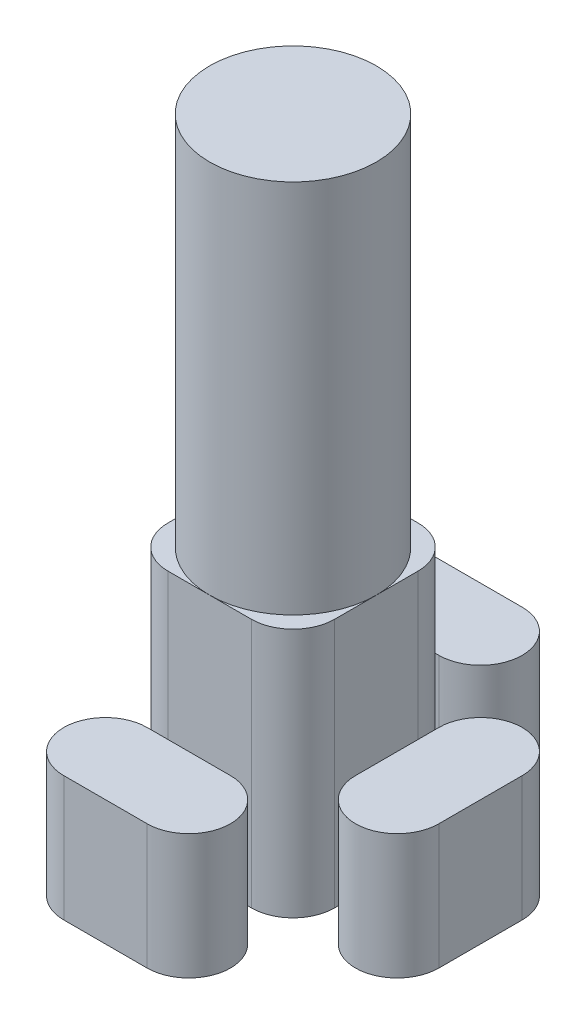
ISO-10303-21;
HEADER;
FILE_DESCRIPTION(('STEP AP214'),'2;1');
FILE_NAME('part.step','',(''),(''),'','','');
FILE_SCHEMA(('AUTOMOTIVE_DESIGN { 1 0 10303 214 1 1 1 1 }'));
ENDSEC;
DATA;
#1=APPLICATION_CONTEXT('core data for automotive mechanical design processes');
#2=APPLICATION_PROTOCOL_DEFINITION('international standard','automotive_design',2000,#1);
#3=PRODUCT_CONTEXT('',#1,'mechanical');
#4=PRODUCT('Part','Part','',(#3));
#5=PRODUCT_RELATED_PRODUCT_CATEGORY('part','',(#4));
#6=PRODUCT_DEFINITION_FORMATION('','',#4);
#7=PRODUCT_DEFINITION_CONTEXT('part definition',#1,'design');
#8=PRODUCT_DEFINITION('design','',#6,#7);
#9=PRODUCT_DEFINITION_SHAPE('','',#8);
#10=(LENGTH_UNIT() NAMED_UNIT(*) SI_UNIT(.MILLI.,.METRE.));
#11=(NAMED_UNIT(*) PLANE_ANGLE_UNIT() SI_UNIT($,.RADIAN.));
#12=(NAMED_UNIT(*) SI_UNIT($,.STERADIAN.) SOLID_ANGLE_UNIT());
#13=UNCERTAINTY_MEASURE_WITH_UNIT(LENGTH_MEASURE(1.E-05),#10,'distance_accuracy_value','');
#14=(GEOMETRIC_REPRESENTATION_CONTEXT(3) GLOBAL_UNCERTAINTY_ASSIGNED_CONTEXT((#13)) GLOBAL_UNIT_ASSIGNED_CONTEXT((#10,
#11,#12)) REPRESENTATION_CONTEXT('',''));
#15=CARTESIAN_POINT('',(0.,0.,0.));
#16=DIRECTION('',(0.,0.,1.));
#17=DIRECTION('',(1.,0.,0.));
#18=AXIS2_PLACEMENT_3D('',#15,#16,#17);
#19=CARTESIAN_POINT('',(-0.100000000000001,0.6,0.349999999999999));
#20=DIRECTION('',(0.,-1.,0.));
#21=DIRECTION('',(0.,0.,-1.));
#22=AXIS2_PLACEMENT_3D('',#19,#20,#21);
#23=CYLINDRICAL_SURFACE('',#22,0.0999999999999995);
#24=CARTESIAN_POINT('',(-0.100000000000001,0.3,0.349999999999999));
#25=DIRECTION('',(0.,1.,0.));
#26=DIRECTION('',(0.,0.,1.));
#27=AXIS2_PLACEMENT_3D('',#24,#25,#26);
#28=CIRCLE('',#27,0.0999999999999999);
#29=CARTESIAN_POINT('',(-0.1,0.3,0.249999999999999));
#30=VERTEX_POINT('',#29);
#31=CARTESIAN_POINT('',(-0.1,0.3,0.449999999999999));
#32=VERTEX_POINT('',#31);
#33=EDGE_CURVE('E82',#30,#32,#28,.T.);
#34=ORIENTED_EDGE('',*,*,#33,.F.);
#35=DIRECTION('',(0.,-1.,0.));
#36=VECTOR('',#35,1.);
#37=CARTESIAN_POINT('',(-0.1,0.6,0.249999999999999));
#38=LINE('',#37,#36);
#39=CARTESIAN_POINT('',(-0.1,0.,0.249999999999999));
#40=VERTEX_POINT('',#39);
#41=EDGE_CURVE('E66',#30,#40,#38,.T.);
#42=ORIENTED_EDGE('',*,*,#41,.T.);
#43=CARTESIAN_POINT('',(-0.100000000000001,0.,0.349999999999999));
#44=DIRECTION('',(0.,1.,0.));
#45=DIRECTION('',(0.,0.,-1.));
#46=AXIS2_PLACEMENT_3D('',#43,#44,#45);
#47=CIRCLE('',#46,0.0999999999999995);
#48=CARTESIAN_POINT('',(-0.1,0.,0.449999999999999));
#49=VERTEX_POINT('',#48);
#50=EDGE_CURVE('E94',#40,#49,#47,.T.);
#51=ORIENTED_EDGE('',*,*,#50,.T.);
#52=DIRECTION('',(0.,-1.,0.));
#53=VECTOR('',#52,1.);
#54=CARTESIAN_POINT('',(-0.1,0.6,0.449999999999999));
#55=LINE('',#54,#53);
#56=EDGE_CURVE('E12',#32,#49,#55,.T.);
#57=ORIENTED_EDGE('',*,*,#56,.F.);
#58=EDGE_LOOP('',(#34,#42,#51,#57));
#59=FACE_BOUND('',#58,.T.);
#60=ADVANCED_FACE('F44',(#59),#23,.T.);
#61=CARTESIAN_POINT('',(0.0999999999999996,0.6,0.45));
#62=DIRECTION('',(0.,0.,-1.));
#63=DIRECTION('',(-1.,0.,0.));
#64=AXIS2_PLACEMENT_3D('',#61,#62,#63);
#65=PLANE('',#64);
#66=DIRECTION('',(1.,0.,0.));
#67=VECTOR('',#66,1.);
#68=CARTESIAN_POINT('',(-0.1,0.3,0.449999999999999));
#69=LINE('',#68,#67);
#70=CARTESIAN_POINT('',(0.0999999999999996,0.3,0.45));
#71=VERTEX_POINT('',#70);
#72=EDGE_CURVE('E85',#32,#71,#69,.T.);
#73=ORIENTED_EDGE('',*,*,#72,.F.);
#74=ORIENTED_EDGE('',*,*,#56,.T.);
#75=DIRECTION('',(1.,0.,0.));
#76=VECTOR('',#75,1.);
#77=CARTESIAN_POINT('',(0.0999999999999996,0.,0.45));
#78=LINE('',#77,#76);
#79=CARTESIAN_POINT('',(0.0999999999999996,0.,0.45));
#80=VERTEX_POINT('',#79);
#81=EDGE_CURVE('E99',#49,#80,#78,.T.);
#82=ORIENTED_EDGE('',*,*,#81,.T.);
#83=DIRECTION('',(0.,-1.,0.));
#84=VECTOR('',#83,1.);
#85=CARTESIAN_POINT('',(0.0999999999999996,0.6,0.45));
#86=LINE('',#85,#84);
#87=EDGE_CURVE('E51',#71,#80,#86,.T.);
#88=ORIENTED_EDGE('',*,*,#87,.F.);
#89=EDGE_LOOP('',(#73,#74,#82,#88));
#90=FACE_BOUND('',#89,.T.);
#91=ADVANCED_FACE('F91',(#90),#65,.F.);
#92=CARTESIAN_POINT('',(0.1,0.6,0.35));
#93=DIRECTION('',(0.,-1.,0.));
#94=DIRECTION('',(0.,0.,-1.));
#95=AXIS2_PLACEMENT_3D('',#92,#93,#94);
#96=CYLINDRICAL_SURFACE('',#95,0.1);
#97=CARTESIAN_POINT('',(0.1,0.3,0.35));
#98=DIRECTION('',(0.,1.,0.));
#99=DIRECTION('',(0.,0.,1.));
#100=AXIS2_PLACEMENT_3D('',#97,#98,#99);
#101=CIRCLE('',#100,0.1);
#102=CARTESIAN_POINT('',(0.0999999999999998,0.3,0.25));
#103=VERTEX_POINT('',#102);
#104=EDGE_CURVE('E58',#71,#103,#101,.T.);
#105=ORIENTED_EDGE('',*,*,#104,.F.);
#106=ORIENTED_EDGE('',*,*,#87,.T.);
#107=CARTESIAN_POINT('',(0.1,0.,0.35));
#108=DIRECTION('',(0.,1.,0.));
#109=DIRECTION('',(0.,0.,-1.));
#110=AXIS2_PLACEMENT_3D('',#107,#108,#109);
#111=CIRCLE('',#110,0.1);
#112=CARTESIAN_POINT('',(0.0999999999999998,0.,0.25));
#113=VERTEX_POINT('',#112);
#114=EDGE_CURVE('E104',#80,#113,#111,.T.);
#115=ORIENTED_EDGE('',*,*,#114,.T.);
#116=DIRECTION('',(0.,-1.,0.));
#117=VECTOR('',#116,1.);
#118=CARTESIAN_POINT('',(0.0999999999999998,0.6,0.25));
#119=LINE('',#118,#117);
#120=EDGE_CURVE('E112',#103,#113,#119,.T.);
#121=ORIENTED_EDGE('',*,*,#120,.F.);
#122=EDGE_LOOP('',(#105,#106,#115,#121));
#123=FACE_BOUND('',#122,.T.);
#124=ADVANCED_FACE('F114',(#123),#96,.T.);
#125=CARTESIAN_POINT('',(0.0999999999999998,0.6,0.25));
#126=DIRECTION('',(0.,0.,1.));
#127=DIRECTION('',(1.,0.,0.));
#128=AXIS2_PLACEMENT_3D('',#125,#126,#127);
#129=PLANE('',#128);
#130=DIRECTION('',(-1.,0.,0.));
#131=VECTOR('',#130,1.);
#132=CARTESIAN_POINT('',(0.0999999999999998,0.3,0.25));
#133=LINE('',#132,#131);
#134=EDGE_CURVE('E86',#103,#30,#133,.T.);
#135=ORIENTED_EDGE('',*,*,#134,.F.);
#136=ORIENTED_EDGE('',*,*,#120,.T.);
#137=DIRECTION('',(-1.,0.,0.));
#138=VECTOR('',#137,1.);
#139=CARTESIAN_POINT('',(0.0999999999999998,0.,0.25));
#140=LINE('',#139,#138);
#141=EDGE_CURVE('E106',#113,#40,#140,.T.);
#142=ORIENTED_EDGE('',*,*,#141,.T.);
#143=ORIENTED_EDGE('',*,*,#41,.F.);
#144=EDGE_LOOP('',(#135,#136,#142,#143));
#145=FACE_BOUND('',#144,.T.);
#146=ADVANCED_FACE('F118',(#145),#129,.F.);
#147=CARTESIAN_POINT('',(-0.100000000000001,0.,0.349999999999999));
#148=DIRECTION('',(0.,1.,0.));
#149=DIRECTION('',(0.,0.,1.));
#150=AXIS2_PLACEMENT_3D('',#147,#148,#149);
#151=PLANE('',#150);
#152=ORIENTED_EDGE('',*,*,#50,.F.);
#153=ORIENTED_EDGE('',*,*,#141,.F.);
#154=ORIENTED_EDGE('',*,*,#114,.F.);
#155=ORIENTED_EDGE('',*,*,#81,.F.);
#156=EDGE_LOOP('',(#152,#153,#154,#155));
#157=FACE_BOUND('',#156,.T.);
#158=ADVANCED_FACE('F102',(#157),#151,.F.);
#159=CARTESIAN_POINT('',(-0.100000000000001,0.3,0.349999999999999));
#160=DIRECTION('',(0.,1.,0.));
#161=DIRECTION('',(0.,0.,1.));
#162=AXIS2_PLACEMENT_3D('',#159,#160,#161);
#163=PLANE('',#162);
#164=ORIENTED_EDGE('',*,*,#33,.T.);
#165=ORIENTED_EDGE('',*,*,#72,.T.);
#166=ORIENTED_EDGE('',*,*,#104,.T.);
#167=ORIENTED_EDGE('',*,*,#134,.T.);
#168=EDGE_LOOP('',(#164,#165,#166,#167));
#169=FACE_BOUND('',#168,.T.);
#170=ADVANCED_FACE('F84',(#169),#163,.T.);
#171=CLOSED_SHELL('',(#60,#91,#124,#146,#158,#170));
#172=MANIFOLD_SOLID_BREP('B2',#171);
#173=CARTESIAN_POINT('',(0.0999999999999998,0.6,-0.25));
#174=DIRECTION('',(0.,0.,-1.));
#175=DIRECTION('',(-1.,0.,0.));
#176=AXIS2_PLACEMENT_3D('',#173,#174,#175);
#177=PLANE('',#176);
#178=DIRECTION('',(1.,0.,0.));
#179=VECTOR('',#178,1.);
#180=CARTESIAN_POINT('',(-0.1,0.3,-0.249999999999999));
#181=LINE('',#180,#179);
#182=CARTESIAN_POINT('',(-0.1,0.3,-0.249999999999999));
#183=VERTEX_POINT('',#182);
#184=CARTESIAN_POINT('',(0.0999999999999998,0.3,-0.25));
#185=VERTEX_POINT('',#184);
#186=EDGE_CURVE('E224',#183,#185,#181,.T.);
#187=ORIENTED_EDGE('',*,*,#186,.F.);
#188=DIRECTION('',(0.,-1.,0.));
#189=VECTOR('',#188,1.);
#190=CARTESIAN_POINT('',(-0.1,0.6,-0.249999999999999));
#191=LINE('',#190,#189);
#192=CARTESIAN_POINT('',(-0.1,0.,-0.249999999999999));
#193=VERTEX_POINT('',#192);
#194=EDGE_CURVE('E42',#183,#193,#191,.T.);
#195=ORIENTED_EDGE('',*,*,#194,.T.);
#196=DIRECTION('',(1.,0.,0.));
#197=VECTOR('',#196,1.);
#198=CARTESIAN_POINT('',(0.0999999999999998,0.,-0.25));
#199=LINE('',#198,#197);
#200=CARTESIAN_POINT('',(0.0999999999999998,0.,-0.25));
#201=VERTEX_POINT('',#200);
#202=EDGE_CURVE('E242',#193,#201,#199,.T.);
#203=ORIENTED_EDGE('',*,*,#202,.T.);
#204=DIRECTION('',(0.,-1.,0.));
#205=VECTOR('',#204,1.);
#206=CARTESIAN_POINT('',(0.0999999999999998,0.6,-0.25));
#207=LINE('',#206,#205);
#208=EDGE_CURVE('E191',#185,#201,#207,.T.);
#209=ORIENTED_EDGE('',*,*,#208,.F.);
#210=EDGE_LOOP('',(#187,#195,#203,#209));
#211=FACE_BOUND('',#210,.T.);
#212=ADVANCED_FACE('F184',(#211),#177,.F.);
#213=CARTESIAN_POINT('',(0.1,0.6,-0.35));
#214=DIRECTION('',(0.,-1.,0.));
#215=DIRECTION('',(0.,0.,-1.));
#216=AXIS2_PLACEMENT_3D('',#213,#214,#215);
#217=CYLINDRICAL_SURFACE('',#216,0.0999999999999998);
#218=CARTESIAN_POINT('',(0.0999999999999994,0.3,-0.35));
#219=DIRECTION('',(0.,1.,0.));
#220=DIRECTION('',(0.,0.,1.));
#221=AXIS2_PLACEMENT_3D('',#218,#219,#220);
#222=CIRCLE('',#221,0.1);
#223=CARTESIAN_POINT('',(0.0999999999999996,0.3,-0.45));
#224=VERTEX_POINT('',#223);
#225=EDGE_CURVE('E231',#185,#224,#222,.T.);
#226=ORIENTED_EDGE('',*,*,#225,.F.);
#227=ORIENTED_EDGE('',*,*,#208,.T.);
#228=CARTESIAN_POINT('',(0.1,0.,-0.35));
#229=DIRECTION('',(0.,1.,0.));
#230=DIRECTION('',(0.,0.,-1.));
#231=AXIS2_PLACEMENT_3D('',#228,#229,#230);
#232=CIRCLE('',#231,0.0999999999999998);
#233=CARTESIAN_POINT('',(0.0999999999999996,0.,-0.45));
#234=VERTEX_POINT('',#233);
#235=EDGE_CURVE('E245',#201,#234,#232,.T.);
#236=ORIENTED_EDGE('',*,*,#235,.T.);
#237=DIRECTION('',(0.,-1.,0.));
#238=VECTOR('',#237,1.);
#239=CARTESIAN_POINT('',(0.0999999999999996,0.6,-0.45));
#240=LINE('',#239,#238);
#241=EDGE_CURVE('E253',#224,#234,#240,.T.);
#242=ORIENTED_EDGE('',*,*,#241,.F.);
#243=EDGE_LOOP('',(#226,#227,#236,#242));
#244=FACE_BOUND('',#243,.T.);
#245=ADVANCED_FACE('F255',(#244),#217,.T.);
#246=CARTESIAN_POINT('',(0.0999999999999996,0.6,-0.45));
#247=DIRECTION('',(0.,0.,1.));
#248=DIRECTION('',(1.,0.,0.));
#249=AXIS2_PLACEMENT_3D('',#246,#247,#248);
#250=PLANE('',#249);
#251=DIRECTION('',(-1.,0.,0.));
#252=VECTOR('',#251,1.);
#253=CARTESIAN_POINT('',(0.0999999999999996,0.3,-0.45));
#254=LINE('',#253,#252);
#255=CARTESIAN_POINT('',(-0.1,0.3,-0.449999999999999));
#256=VERTEX_POINT('',#255);
#257=EDGE_CURVE('E198',#224,#256,#254,.T.);
#258=ORIENTED_EDGE('',*,*,#257,.F.);
#259=ORIENTED_EDGE('',*,*,#241,.T.);
#260=DIRECTION('',(-1.,0.,0.));
#261=VECTOR('',#260,1.);
#262=CARTESIAN_POINT('',(0.0999999999999996,0.,-0.45));
#263=LINE('',#262,#261);
#264=CARTESIAN_POINT('',(-0.1,0.,-0.449999999999999));
#265=VERTEX_POINT('',#264);
#266=EDGE_CURVE('E239',#234,#265,#263,.T.);
#267=ORIENTED_EDGE('',*,*,#266,.T.);
#268=DIRECTION('',(0.,-1.,0.));
#269=VECTOR('',#268,1.);
#270=CARTESIAN_POINT('',(-0.1,0.6,-0.449999999999999));
#271=LINE('',#270,#269);
#272=EDGE_CURVE('E205',#256,#265,#271,.T.);
#273=ORIENTED_EDGE('',*,*,#272,.F.);
#274=EDGE_LOOP('',(#258,#259,#267,#273));
#275=FACE_BOUND('',#274,.T.);
#276=ADVANCED_FACE('F258',(#275),#250,.F.);
#277=CARTESIAN_POINT('',(-0.1,0.6,-0.349999999999999));
#278=DIRECTION('',(0.,-1.,0.));
#279=DIRECTION('',(0.,0.,-1.));
#280=AXIS2_PLACEMENT_3D('',#277,#278,#279);
#281=CYLINDRICAL_SURFACE('',#280,0.0999999999999998);
#282=CARTESIAN_POINT('',(-0.100000000000001,0.3,-0.349999999999999));
#283=DIRECTION('',(0.,1.,0.));
#284=DIRECTION('',(0.,0.,1.));
#285=AXIS2_PLACEMENT_3D('',#282,#283,#284);
#286=CIRCLE('',#285,0.0999999999999999);
#287=EDGE_CURVE('E221',#256,#183,#286,.T.);
#288=ORIENTED_EDGE('',*,*,#287,.F.);
#289=ORIENTED_EDGE('',*,*,#272,.T.);
#290=CARTESIAN_POINT('',(-0.1,0.,-0.349999999999999));
#291=DIRECTION('',(0.,1.,0.));
#292=DIRECTION('',(0.,0.,1.));
#293=AXIS2_PLACEMENT_3D('',#290,#291,#292);
#294=CIRCLE('',#293,0.0999999999999998);
#295=EDGE_CURVE('E235',#265,#193,#294,.T.);
#296=ORIENTED_EDGE('',*,*,#295,.T.);
#297=ORIENTED_EDGE('',*,*,#194,.F.);
#298=EDGE_LOOP('',(#288,#289,#296,#297));
#299=FACE_BOUND('',#298,.T.);
#300=ADVANCED_FACE('F233',(#299),#281,.T.);
#301=CARTESIAN_POINT('',(-0.100000000000001,0.,-0.349999999999999));
#302=DIRECTION('',(0.,-1.,0.));
#303=DIRECTION('',(0.,0.,-1.));
#304=AXIS2_PLACEMENT_3D('',#301,#302,#303);
#305=PLANE('',#304);
#306=ORIENTED_EDGE('',*,*,#202,.F.);
#307=ORIENTED_EDGE('',*,*,#295,.F.);
#308=ORIENTED_EDGE('',*,*,#266,.F.);
#309=ORIENTED_EDGE('',*,*,#235,.F.);
#310=EDGE_LOOP('',(#306,#307,#308,#309));
#311=FACE_BOUND('',#310,.T.);
#312=ADVANCED_FACE('F243',(#311),#305,.T.);
#313=CARTESIAN_POINT('',(-0.100000000000001,0.3,-0.349999999999999));
#314=DIRECTION('',(0.,1.,0.));
#315=DIRECTION('',(0.,0.,1.));
#316=AXIS2_PLACEMENT_3D('',#313,#314,#315);
#317=PLANE('',#316);
#318=ORIENTED_EDGE('',*,*,#287,.T.);
#319=ORIENTED_EDGE('',*,*,#186,.T.);
#320=ORIENTED_EDGE('',*,*,#225,.T.);
#321=ORIENTED_EDGE('',*,*,#257,.T.);
#322=EDGE_LOOP('',(#318,#319,#320,#321));
#323=FACE_BOUND('',#322,.T.);
#324=ADVANCED_FACE('F223',(#323),#317,.T.);
#325=CLOSED_SHELL('',(#212,#245,#276,#300,#312,#324));
#326=MANIFOLD_SOLID_BREP('B6',#325);
#327=CARTESIAN_POINT('',(-0.1,0.6,-0.1));
#328=DIRECTION('',(0.,-1.,0.));
#329=DIRECTION('',(0.,0.,-1.));
#330=AXIS2_PLACEMENT_3D('',#327,#328,#329);
#331=PLANE('',#330);
#332=CARTESIAN_POINT('',(0.,0.6,0.));
#333=DIRECTION('',(0.,1.,0.));
#334=DIRECTION('',(0.,0.,1.));
#335=AXIS2_PLACEMENT_3D('',#332,#333,#334);
#336=CIRCLE('',#335,0.2);
#337=CARTESIAN_POINT('',(0.,0.6,0.2));
#338=VERTEX_POINT('',#337);
#339=CARTESIAN_POINT('',(0.2,0.6,0.));
#340=VERTEX_POINT('',#339);
#341=EDGE_CURVE('E334',#338,#340,#336,.T.);
#342=ORIENTED_EDGE('',*,*,#341,.F.);
#343=DIRECTION('',(1.,0.,0.));
#344=VECTOR('',#343,1.);
#345=CARTESIAN_POINT('',(-0.1,0.6,0.200000000000001));
#346=LINE('',#345,#344);
#347=CARTESIAN_POINT('',(0.1,0.6,0.2));
#348=VERTEX_POINT('',#347);
#349=EDGE_CURVE('E413',#338,#348,#346,.T.);
#350=ORIENTED_EDGE('',*,*,#349,.T.);
#351=CARTESIAN_POINT('',(0.1,0.6,0.1));
#352=DIRECTION('',(0.,1.,0.));
#353=DIRECTION('',(0.,0.,-1.));
#354=AXIS2_PLACEMENT_3D('',#351,#352,#353);
#355=CIRCLE('',#354,0.0999999999999998);
#356=CARTESIAN_POINT('',(0.2,0.6,0.1));
#357=VERTEX_POINT('',#356);
#358=EDGE_CURVE('E412',#348,#357,#355,.T.);
#359=ORIENTED_EDGE('',*,*,#358,.T.);
#360=DIRECTION('',(0.,0.,-1.));
#361=VECTOR('',#360,1.);
#362=CARTESIAN_POINT('',(0.2,0.6,0.1));
#363=LINE('',#362,#361);
#364=EDGE_CURVE('E425',#357,#340,#363,.T.);
#365=ORIENTED_EDGE('',*,*,#364,.T.);
#366=EDGE_LOOP('',(#342,#350,#359,#365));
#367=FACE_BOUND('',#366,.T.);
#368=ADVANCED_FACE('F323',(#367),#331,.F.);
#369=CARTESIAN_POINT('',(0.,0.6,-0.2));
#370=VERTEX_POINT('',#369);
#371=EDGE_CURVE('E182',#340,#370,#336,.T.);
#372=ORIENTED_EDGE('',*,*,#371,.F.);
#373=CARTESIAN_POINT('',(0.2,0.6,-0.1));
#374=VERTEX_POINT('',#373);
#375=EDGE_CURVE('E442',#340,#374,#363,.T.);
#376=ORIENTED_EDGE('',*,*,#375,.T.);
#377=CARTESIAN_POINT('',(0.1,0.6,-0.1));
#378=DIRECTION('',(0.,1.,0.));
#379=DIRECTION('',(0.,0.,1.));
#380=AXIS2_PLACEMENT_3D('',#377,#378,#379);
#381=CIRCLE('',#380,0.0999999999999998);
#382=CARTESIAN_POINT('',(0.1,0.6,-0.2));
#383=VERTEX_POINT('',#382);
#384=EDGE_CURVE('E444',#374,#383,#381,.T.);
#385=ORIENTED_EDGE('',*,*,#384,.T.);
#386=DIRECTION('',(-1.,0.,0.));
#387=VECTOR('',#386,1.);
#388=CARTESIAN_POINT('',(-0.1,0.6,-0.199999999999999));
#389=LINE('',#388,#387);
#390=EDGE_CURVE('E447',#383,#370,#389,.T.);
#391=ORIENTED_EDGE('',*,*,#390,.T.);
#392=EDGE_LOOP('',(#372,#376,#385,#391));
#393=FACE_BOUND('',#392,.T.);
#394=ADVANCED_FACE('F498',(#393),#331,.F.);
#395=CARTESIAN_POINT('',(-0.2,0.6,0.));
#396=VERTEX_POINT('',#395);
#397=EDGE_CURVE('E332',#370,#396,#336,.T.);
#398=ORIENTED_EDGE('',*,*,#397,.F.);
#399=CARTESIAN_POINT('',(-0.1,0.6,-0.199999999999999));
#400=VERTEX_POINT('',#399);
#401=EDGE_CURVE('E446',#370,#400,#389,.T.);
#402=ORIENTED_EDGE('',*,*,#401,.T.);
#403=CARTESIAN_POINT('',(-0.1,0.6,-0.1));
#404=DIRECTION('',(0.,1.,0.));
#405=DIRECTION('',(0.,0.,-1.));
#406=AXIS2_PLACEMENT_3D('',#403,#404,#405);
#407=CIRCLE('',#406,0.0999999999999998);
#408=CARTESIAN_POINT('',(-0.2,0.6,-0.1));
#409=VERTEX_POINT('',#408);
#410=EDGE_CURVE('E433',#400,#409,#407,.T.);
#411=ORIENTED_EDGE('',*,*,#410,.T.);
#412=DIRECTION('',(0.,0.,1.));
#413=VECTOR('',#412,1.);
#414=CARTESIAN_POINT('',(-0.2,0.6,0.1));
#415=LINE('',#414,#413);
#416=EDGE_CURVE('E438',#409,#396,#415,.T.);
#417=ORIENTED_EDGE('',*,*,#416,.T.);
#418=EDGE_LOOP('',(#398,#402,#411,#417));
#419=FACE_BOUND('',#418,.T.);
#420=ADVANCED_FACE('F509',(#419),#331,.F.);
#421=CARTESIAN_POINT('',(-0.1,0.6,-0.1));
#422=DIRECTION('',(0.,-1.,0.));
#423=DIRECTION('',(0.,0.,-1.));
#424=AXIS2_PLACEMENT_3D('',#421,#422,#423);
#425=CYLINDRICAL_SURFACE('',#424,0.0999999999999998);
#426=CARTESIAN_POINT('',(-0.1,0.,-0.1));
#427=DIRECTION('',(0.,1.,0.));
#428=DIRECTION('',(0.,0.,-1.));
#429=AXIS2_PLACEMENT_3D('',#426,#427,#428);
#430=CIRCLE('',#429,0.0999999999999998);
#431=CARTESIAN_POINT('',(-0.1,0.,-0.199999999999999));
#432=VERTEX_POINT('',#431);
#433=CARTESIAN_POINT('',(-0.2,0.,-0.1));
#434=VERTEX_POINT('',#433);
#435=EDGE_CURVE('E450',#432,#434,#430,.T.);
#436=ORIENTED_EDGE('',*,*,#435,.T.);
#437=DIRECTION('',(0.,-1.,0.));
#438=VECTOR('',#437,1.);
#439=CARTESIAN_POINT('',(-0.2,0.6,-0.1));
#440=LINE('',#439,#438);
#441=EDGE_CURVE('E327',#409,#434,#440,.T.);
#442=ORIENTED_EDGE('',*,*,#441,.F.);
#443=ORIENTED_EDGE('',*,*,#410,.F.);
#444=DIRECTION('',(0.,-1.,0.));
#445=VECTOR('',#444,1.);
#446=CARTESIAN_POINT('',(-0.1,0.6,-0.199999999999999));
#447=LINE('',#446,#445);
#448=EDGE_CURVE('E449',#400,#432,#447,.T.);
#449=ORIENTED_EDGE('',*,*,#448,.T.);
#450=EDGE_LOOP('',(#436,#442,#443,#449));
#451=FACE_BOUND('',#450,.T.);
#452=ADVANCED_FACE('F325',(#451),#425,.T.);
#453=CARTESIAN_POINT('',(-0.2,0.6,0.1));
#454=DIRECTION('',(1.,0.,0.));
#455=DIRECTION('',(0.,0.,-1.));
#456=AXIS2_PLACEMENT_3D('',#453,#454,#455);
#457=PLANE('',#456);
#458=DIRECTION('',(0.,0.,1.));
#459=VECTOR('',#458,1.);
#460=CARTESIAN_POINT('',(-0.2,0.,0.1));
#461=LINE('',#460,#459);
#462=CARTESIAN_POINT('',(-0.2,0.,0.1));
#463=VERTEX_POINT('',#462);
#464=EDGE_CURVE('E453',#434,#463,#461,.T.);
#465=ORIENTED_EDGE('',*,*,#464,.T.);
#466=DIRECTION('',(0.,-1.,0.));
#467=VECTOR('',#466,1.);
#468=CARTESIAN_POINT('',(-0.2,0.6,0.1));
#469=LINE('',#468,#467);
#470=CARTESIAN_POINT('',(-0.2,0.6,0.1));
#471=VERTEX_POINT('',#470);
#472=EDGE_CURVE('E430',#471,#463,#469,.T.);
#473=ORIENTED_EDGE('',*,*,#472,.F.);
#474=EDGE_CURVE('E436',#396,#471,#415,.T.);
#475=ORIENTED_EDGE('',*,*,#474,.F.);
#476=ORIENTED_EDGE('',*,*,#416,.F.);
#477=ORIENTED_EDGE('',*,*,#441,.T.);
#478=EDGE_LOOP('',(#465,#473,#475,#476,#477));
#479=FACE_BOUND('',#478,.T.);
#480=ADVANCED_FACE('F512',(#479),#457,.F.);
#481=CARTESIAN_POINT('',(-0.1,0.6,0.1));
#482=DIRECTION('',(0.,-1.,0.));
#483=DIRECTION('',(0.,0.,-1.));
#484=AXIS2_PLACEMENT_3D('',#481,#482,#483);
#485=CYLINDRICAL_SURFACE('',#484,0.100000000000001);
#486=CARTESIAN_POINT('',(-0.1,0.,0.1));
#487=DIRECTION('',(0.,1.,0.));
#488=DIRECTION('',(0.,0.,1.));
#489=AXIS2_PLACEMENT_3D('',#486,#487,#488);
#490=CIRCLE('',#489,0.100000000000001);
#491=CARTESIAN_POINT('',(-0.1,0.,0.200000000000001));
#492=VERTEX_POINT('',#491);
#493=EDGE_CURVE('E455',#463,#492,#490,.T.);
#494=ORIENTED_EDGE('',*,*,#493,.T.);
#495=DIRECTION('',(0.,-1.,0.));
#496=VECTOR('',#495,1.);
#497=CARTESIAN_POINT('',(-0.1,0.6,0.200000000000001));
#498=LINE('',#497,#496);
#499=CARTESIAN_POINT('',(-0.1,0.6,0.200000000000001));
#500=VERTEX_POINT('',#499);
#501=EDGE_CURVE('E478',#500,#492,#498,.T.);
#502=ORIENTED_EDGE('',*,*,#501,.F.);
#503=CARTESIAN_POINT('',(-0.1,0.6,0.1));
#504=DIRECTION('',(0.,1.,0.));
#505=DIRECTION('',(0.,0.,1.));
#506=AXIS2_PLACEMENT_3D('',#503,#504,#505);
#507=CIRCLE('',#506,0.100000000000001);
#508=EDGE_CURVE('E408',#471,#500,#507,.T.);
#509=ORIENTED_EDGE('',*,*,#508,.F.);
#510=ORIENTED_EDGE('',*,*,#472,.T.);
#511=EDGE_LOOP('',(#494,#502,#509,#510));
#512=FACE_BOUND('',#511,.T.);
#513=ADVANCED_FACE('F483',(#512),#485,.T.);
#514=CARTESIAN_POINT('',(-0.1,0.6,0.200000000000001));
#515=DIRECTION('',(0.,0.,-1.));
#516=DIRECTION('',(-1.,0.,0.));
#517=AXIS2_PLACEMENT_3D('',#514,#515,#516);
#518=PLANE('',#517);
#519=DIRECTION('',(1.,0.,0.));
#520=VECTOR('',#519,1.);
#521=CARTESIAN_POINT('',(-0.1,0.,0.200000000000001));
#522=LINE('',#521,#520);
#523=CARTESIAN_POINT('',(0.1,0.,0.2));
#524=VERTEX_POINT('',#523);
#525=EDGE_CURVE('E457',#492,#524,#522,.T.);
#526=ORIENTED_EDGE('',*,*,#525,.T.);
#527=DIRECTION('',(0.,-1.,0.));
#528=VECTOR('',#527,1.);
#529=CARTESIAN_POINT('',(0.1,0.6,0.2));
#530=LINE('',#529,#528);
#531=EDGE_CURVE('E419',#348,#524,#530,.T.);
#532=ORIENTED_EDGE('',*,*,#531,.F.);
#533=ORIENTED_EDGE('',*,*,#349,.F.);
#534=EDGE_CURVE('E401',#500,#338,#346,.T.);
#535=ORIENTED_EDGE('',*,*,#534,.F.);
#536=ORIENTED_EDGE('',*,*,#501,.T.);
#537=EDGE_LOOP('',(#526,#532,#533,#535,#536));
#538=FACE_BOUND('',#537,.T.);
#539=ADVANCED_FACE('F417',(#538),#518,.F.);
#540=CARTESIAN_POINT('',(0.1,0.6,0.1));
#541=DIRECTION('',(0.,-1.,0.));
#542=DIRECTION('',(0.,0.,-1.));
#543=AXIS2_PLACEMENT_3D('',#540,#541,#542);
#544=CYLINDRICAL_SURFACE('',#543,0.0999999999999998);
#545=CARTESIAN_POINT('',(0.1,0.,0.1));
#546=DIRECTION('',(0.,1.,0.));
#547=DIRECTION('',(0.,0.,-1.));
#548=AXIS2_PLACEMENT_3D('',#545,#546,#547);
#549=CIRCLE('',#548,0.0999999999999998);
#550=CARTESIAN_POINT('',(0.2,0.,0.1));
#551=VERTEX_POINT('',#550);
#552=EDGE_CURVE('E459',#524,#551,#549,.T.);
#553=ORIENTED_EDGE('',*,*,#552,.T.);
#554=DIRECTION('',(0.,-1.,0.));
#555=VECTOR('',#554,1.);
#556=CARTESIAN_POINT('',(0.2,0.6,0.1));
#557=LINE('',#556,#555);
#558=EDGE_CURVE('E474',#357,#551,#557,.T.);
#559=ORIENTED_EDGE('',*,*,#558,.F.);
#560=ORIENTED_EDGE('',*,*,#358,.F.);
#561=ORIENTED_EDGE('',*,*,#531,.T.);
#562=EDGE_LOOP('',(#553,#559,#560,#561));
#563=FACE_BOUND('',#562,.T.);
#564=ADVANCED_FACE('F492',(#563),#544,.T.);
#565=CARTESIAN_POINT('',(0.2,0.6,0.1));
#566=DIRECTION('',(-1.,0.,0.));
#567=DIRECTION('',(0.,0.,1.));
#568=AXIS2_PLACEMENT_3D('',#565,#566,#567);
#569=PLANE('',#568);
#570=DIRECTION('',(0.,0.,-1.));
#571=VECTOR('',#570,1.);
#572=CARTESIAN_POINT('',(0.2,0.,0.1));
#573=LINE('',#572,#571);
#574=CARTESIAN_POINT('',(0.2,0.,-0.1));
#575=VERTEX_POINT('',#574);
#576=EDGE_CURVE('E461',#551,#575,#573,.T.);
#577=ORIENTED_EDGE('',*,*,#576,.T.);
#578=DIRECTION('',(0.,-1.,0.));
#579=VECTOR('',#578,1.);
#580=CARTESIAN_POINT('',(0.2,0.6,-0.1));
#581=LINE('',#580,#579);
#582=EDGE_CURVE('E471',#374,#575,#581,.T.);
#583=ORIENTED_EDGE('',*,*,#582,.F.);
#584=ORIENTED_EDGE('',*,*,#375,.F.);
#585=ORIENTED_EDGE('',*,*,#364,.F.);
#586=ORIENTED_EDGE('',*,*,#558,.T.);
#587=EDGE_LOOP('',(#577,#583,#584,#585,#586));
#588=FACE_BOUND('',#587,.T.);
#589=ADVANCED_FACE('F495',(#588),#569,.F.);
#590=CARTESIAN_POINT('',(0.1,0.6,-0.1));
#591=DIRECTION('',(0.,-1.,0.));
#592=DIRECTION('',(0.,0.,-1.));
#593=AXIS2_PLACEMENT_3D('',#590,#591,#592);
#594=CYLINDRICAL_SURFACE('',#593,0.0999999999999998);
#595=CARTESIAN_POINT('',(0.1,0.,-0.1));
#596=DIRECTION('',(0.,1.,0.));
#597=DIRECTION('',(0.,0.,1.));
#598=AXIS2_PLACEMENT_3D('',#595,#596,#597);
#599=CIRCLE('',#598,0.0999999999999998);
#600=CARTESIAN_POINT('',(0.1,0.,-0.2));
#601=VERTEX_POINT('',#600);
#602=EDGE_CURVE('E463',#575,#601,#599,.T.);
#603=ORIENTED_EDGE('',*,*,#602,.T.);
#604=DIRECTION('',(0.,-1.,0.));
#605=VECTOR('',#604,1.);
#606=CARTESIAN_POINT('',(0.1,0.6,-0.2));
#607=LINE('',#606,#605);
#608=EDGE_CURVE('E468',#383,#601,#607,.T.);
#609=ORIENTED_EDGE('',*,*,#608,.F.);
#610=ORIENTED_EDGE('',*,*,#384,.F.);
#611=ORIENTED_EDGE('',*,*,#582,.T.);
#612=EDGE_LOOP('',(#603,#609,#610,#611));
#613=FACE_BOUND('',#612,.T.);
#614=ADVANCED_FACE('F502',(#613),#594,.T.);
#615=CARTESIAN_POINT('',(-0.1,0.6,-0.199999999999999));
#616=DIRECTION('',(0.,0.,1.));
#617=DIRECTION('',(1.,0.,0.));
#618=AXIS2_PLACEMENT_3D('',#615,#616,#617);
#619=PLANE('',#618);
#620=DIRECTION('',(-1.,0.,0.));
#621=VECTOR('',#620,1.);
#622=CARTESIAN_POINT('',(-0.1,0.,-0.199999999999999));
#623=LINE('',#622,#621);
#624=EDGE_CURVE('E437',#601,#432,#623,.T.);
#625=ORIENTED_EDGE('',*,*,#624,.T.);
#626=ORIENTED_EDGE('',*,*,#448,.F.);
#627=ORIENTED_EDGE('',*,*,#401,.F.);
#628=ORIENTED_EDGE('',*,*,#390,.F.);
#629=ORIENTED_EDGE('',*,*,#608,.T.);
#630=EDGE_LOOP('',(#625,#626,#627,#628,#629));
#631=FACE_BOUND('',#630,.T.);
#632=ADVANCED_FACE('F506',(#631),#619,.F.);
#633=EDGE_CURVE('E405',#396,#338,#336,.T.);
#634=ORIENTED_EDGE('',*,*,#633,.F.);
#635=ORIENTED_EDGE('',*,*,#474,.T.);
#636=ORIENTED_EDGE('',*,*,#508,.T.);
#637=ORIENTED_EDGE('',*,*,#534,.T.);
#638=EDGE_LOOP('',(#634,#635,#636,#637));
#639=FACE_BOUND('',#638,.T.);
#640=ADVANCED_FACE('F403',(#639),#331,.F.);
#641=CARTESIAN_POINT('',(-0.1,0.,-0.1));
#642=DIRECTION('',(0.,-1.,0.));
#643=DIRECTION('',(0.,0.,-1.));
#644=AXIS2_PLACEMENT_3D('',#641,#642,#643);
#645=PLANE('',#644);
#646=ORIENTED_EDGE('',*,*,#435,.F.);
#647=ORIENTED_EDGE('',*,*,#624,.F.);
#648=ORIENTED_EDGE('',*,*,#602,.F.);
#649=ORIENTED_EDGE('',*,*,#576,.F.);
#650=ORIENTED_EDGE('',*,*,#552,.F.);
#651=ORIENTED_EDGE('',*,*,#525,.F.);
#652=ORIENTED_EDGE('',*,*,#493,.F.);
#653=ORIENTED_EDGE('',*,*,#464,.F.);
#654=EDGE_LOOP('',(#646,#647,#648,#649,#650,#651,#652,#653));
#655=FACE_BOUND('',#654,.T.);
#656=ADVANCED_FACE('F488',(#655),#645,.T.);
#657=CARTESIAN_POINT('',(0.,1.5,0.));
#658=DIRECTION('',(0.,-1.,0.));
#659=DIRECTION('',(0.,0.,-1.));
#660=AXIS2_PLACEMENT_3D('',#657,#658,#659);
#661=CYLINDRICAL_SURFACE('',#660,0.2);
#662=CARTESIAN_POINT('',(0.,1.5,0.));
#663=DIRECTION('',(0.,1.,0.));
#664=DIRECTION('',(0.,0.,1.));
#665=AXIS2_PLACEMENT_3D('',#662,#663,#664);
#666=CIRCLE('',#665,0.2);
#667=CARTESIAN_POINT('',(0.,1.5,0.2));
#668=VERTEX_POINT('',#667);
#669=EDGE_CURVE('E427',#668,#668,#666,.T.);
#670=ORIENTED_EDGE('',*,*,#669,.F.);
#671=EDGE_LOOP('',(#670));
#672=FACE_BOUND('',#671,.T.);
#673=ORIENTED_EDGE('',*,*,#341,.T.);
#674=ORIENTED_EDGE('',*,*,#371,.T.);
#675=ORIENTED_EDGE('',*,*,#397,.T.);
#676=ORIENTED_EDGE('',*,*,#633,.T.);
#677=EDGE_LOOP('',(#673,#674,#675,#676));
#678=FACE_BOUND('',#677,.T.);
#679=ADVANCED_FACE('F428',(#672,#678),#661,.T.);
#680=CARTESIAN_POINT('',(0.,1.5,0.));
#681=DIRECTION('',(0.,1.,0.));
#682=DIRECTION('',(0.,0.,1.));
#683=AXIS2_PLACEMENT_3D('',#680,#681,#682);
#684=PLANE('',#683);
#685=ORIENTED_EDGE('',*,*,#669,.T.);
#686=EDGE_LOOP('',(#685));
#687=FACE_BOUND('',#686,.T.);
#688=ADVANCED_FACE('F596',(#687),#684,.T.);
#689=CLOSED_SHELL('',(#368,#394,#420,#452,#480,#513,#539,#564,#589,#614,#632,#640,#656,#679,#688));
#690=MANIFOLD_SOLID_BREP('B36',#689);
#691=CARTESIAN_POINT('',(0.25,0.6,0.1));
#692=DIRECTION('',(1.,0.,0.));
#693=DIRECTION('',(0.,0.,-1.));
#694=AXIS2_PLACEMENT_3D('',#691,#692,#693);
#695=PLANE('',#694);
#696=DIRECTION('',(0.,0.,1.));
#697=VECTOR('',#696,1.);
#698=CARTESIAN_POINT('',(0.25,0.3,-0.1));
#699=LINE('',#698,#697);
#700=CARTESIAN_POINT('',(0.25,0.3,-0.1));
#701=VERTEX_POINT('',#700);
#702=CARTESIAN_POINT('',(0.25,0.3,0.1));
#703=VERTEX_POINT('',#702);
#704=EDGE_CURVE('E676',#701,#703,#699,.T.);
#705=ORIENTED_EDGE('',*,*,#704,.F.);
#706=DIRECTION('',(0.,-1.,0.));
#707=VECTOR('',#706,1.);
#708=CARTESIAN_POINT('',(0.25,0.6,-0.1));
#709=LINE('',#708,#707);
#710=CARTESIAN_POINT('',(0.25,0.,-0.1));
#711=VERTEX_POINT('',#710);
#712=EDGE_CURVE('E321',#701,#711,#709,.T.);
#713=ORIENTED_EDGE('',*,*,#712,.T.);
#714=DIRECTION('',(0.,0.,1.));
#715=VECTOR('',#714,1.);
#716=CARTESIAN_POINT('',(0.25,0.,0.1));
#717=LINE('',#716,#715);
#718=CARTESIAN_POINT('',(0.25,0.,0.1));
#719=VERTEX_POINT('',#718);
#720=EDGE_CURVE('E694',#711,#719,#717,.T.);
#721=ORIENTED_EDGE('',*,*,#720,.T.);
#722=DIRECTION('',(0.,-1.,0.));
#723=VECTOR('',#722,1.);
#724=CARTESIAN_POINT('',(0.25,0.6,0.1));
#725=LINE('',#724,#723);
#726=EDGE_CURVE('E643',#703,#719,#725,.T.);
#727=ORIENTED_EDGE('',*,*,#726,.F.);
#728=EDGE_LOOP('',(#705,#713,#721,#727));
#729=FACE_BOUND('',#728,.T.);
#730=ADVANCED_FACE('F636',(#729),#695,.F.);
#731=CARTESIAN_POINT('',(0.35,0.6,0.100000000000001));
#732=DIRECTION('',(0.,-1.,0.));
#733=DIRECTION('',(0.,0.,-1.));
#734=AXIS2_PLACEMENT_3D('',#731,#732,#733);
#735=CYLINDRICAL_SURFACE('',#734,0.0999999999999998);
#736=CARTESIAN_POINT('',(0.35,0.3,0.1));
#737=DIRECTION('',(0.,1.,0.));
#738=DIRECTION('',(0.,0.,1.));
#739=AXIS2_PLACEMENT_3D('',#736,#737,#738);
#740=CIRCLE('',#739,0.1);
#741=CARTESIAN_POINT('',(0.45,0.3,0.100000000000001));
#742=VERTEX_POINT('',#741);
#743=EDGE_CURVE('E683',#703,#742,#740,.T.);
#744=ORIENTED_EDGE('',*,*,#743,.F.);
#745=ORIENTED_EDGE('',*,*,#726,.T.);
#746=CARTESIAN_POINT('',(0.35,0.,0.100000000000001));
#747=DIRECTION('',(0.,1.,0.));
#748=DIRECTION('',(0.,0.,-1.));
#749=AXIS2_PLACEMENT_3D('',#746,#747,#748);
#750=CIRCLE('',#749,0.0999999999999998);
#751=CARTESIAN_POINT('',(0.45,0.,0.100000000000001));
#752=VERTEX_POINT('',#751);
#753=EDGE_CURVE('E697',#719,#752,#750,.T.);
#754=ORIENTED_EDGE('',*,*,#753,.T.);
#755=DIRECTION('',(0.,-1.,0.));
#756=VECTOR('',#755,1.);
#757=CARTESIAN_POINT('',(0.45,0.6,0.100000000000001));
#758=LINE('',#757,#756);
#759=EDGE_CURVE('E705',#742,#752,#758,.T.);
#760=ORIENTED_EDGE('',*,*,#759,.F.);
#761=EDGE_LOOP('',(#744,#745,#754,#760));
#762=FACE_BOUND('',#761,.T.);
#763=ADVANCED_FACE('F707',(#762),#735,.T.);
#764=CARTESIAN_POINT('',(0.45,0.6,0.100000000000001));
#765=DIRECTION('',(-1.,0.,0.));
#766=DIRECTION('',(0.,0.,1.));
#767=AXIS2_PLACEMENT_3D('',#764,#765,#766);
#768=PLANE('',#767);
#769=DIRECTION('',(0.,0.,-1.));
#770=VECTOR('',#769,1.);
#771=CARTESIAN_POINT('',(0.45,0.3,0.100000000000001));
#772=LINE('',#771,#770);
#773=CARTESIAN_POINT('',(0.45,0.3,-0.0999999999999993));
#774=VERTEX_POINT('',#773);
#775=EDGE_CURVE('E650',#742,#774,#772,.T.);
#776=ORIENTED_EDGE('',*,*,#775,.F.);
#777=ORIENTED_EDGE('',*,*,#759,.T.);
#778=DIRECTION('',(0.,0.,-1.));
#779=VECTOR('',#778,1.);
#780=CARTESIAN_POINT('',(0.45,0.,0.100000000000001));
#781=LINE('',#780,#779);
#782=CARTESIAN_POINT('',(0.45,0.,-0.0999999999999993));
#783=VERTEX_POINT('',#782);
#784=EDGE_CURVE('E691',#752,#783,#781,.T.);
#785=ORIENTED_EDGE('',*,*,#784,.T.);
#786=DIRECTION('',(0.,-1.,0.));
#787=VECTOR('',#786,1.);
#788=CARTESIAN_POINT('',(0.45,0.6,-0.0999999999999993));
#789=LINE('',#788,#787);
#790=EDGE_CURVE('E657',#774,#783,#789,.T.);
#791=ORIENTED_EDGE('',*,*,#790,.F.);
#792=EDGE_LOOP('',(#776,#777,#785,#791));
#793=FACE_BOUND('',#792,.T.);
#794=ADVANCED_FACE('F710',(#793),#768,.F.);
#795=CARTESIAN_POINT('',(0.35,0.6,-0.0999999999999993));
#796=DIRECTION('',(0.,-1.,0.));
#797=DIRECTION('',(0.,0.,-1.));
#798=AXIS2_PLACEMENT_3D('',#795,#796,#797);
#799=CYLINDRICAL_SURFACE('',#798,0.0999999999999998);
#800=CARTESIAN_POINT('',(0.35,0.3,-0.1));
#801=DIRECTION('',(0.,1.,0.));
#802=DIRECTION('',(0.,0.,1.));
#803=AXIS2_PLACEMENT_3D('',#800,#801,#802);
#804=CIRCLE('',#803,0.0999999999999999);
#805=EDGE_CURVE('E673',#774,#701,#804,.T.);
#806=ORIENTED_EDGE('',*,*,#805,.F.);
#807=ORIENTED_EDGE('',*,*,#790,.T.);
#808=CARTESIAN_POINT('',(0.35,0.,-0.0999999999999993));
#809=DIRECTION('',(0.,1.,0.));
#810=DIRECTION('',(0.,0.,1.));
#811=AXIS2_PLACEMENT_3D('',#808,#809,#810);
#812=CIRCLE('',#811,0.0999999999999998);
#813=EDGE_CURVE('E687',#783,#711,#812,.T.);
#814=ORIENTED_EDGE('',*,*,#813,.T.);
#815=ORIENTED_EDGE('',*,*,#712,.F.);
#816=EDGE_LOOP('',(#806,#807,#814,#815));
#817=FACE_BOUND('',#816,.T.);
#818=ADVANCED_FACE('F685',(#817),#799,.T.);
#819=CARTESIAN_POINT('',(0.35,0.,-0.1));
#820=DIRECTION('',(0.,-1.,0.));
#821=DIRECTION('',(0.,0.,-1.));
#822=AXIS2_PLACEMENT_3D('',#819,#820,#821);
#823=PLANE('',#822);
#824=ORIENTED_EDGE('',*,*,#720,.F.);
#825=ORIENTED_EDGE('',*,*,#813,.F.);
#826=ORIENTED_EDGE('',*,*,#784,.F.);
#827=ORIENTED_EDGE('',*,*,#753,.F.);
#828=EDGE_LOOP('',(#824,#825,#826,#827));
#829=FACE_BOUND('',#828,.T.);
#830=ADVANCED_FACE('F695',(#829),#823,.T.);
#831=CARTESIAN_POINT('',(0.35,0.3,-0.1));
#832=DIRECTION('',(0.,1.,0.));
#833=DIRECTION('',(0.,0.,1.));
#834=AXIS2_PLACEMENT_3D('',#831,#832,#833);
#835=PLANE('',#834);
#836=ORIENTED_EDGE('',*,*,#805,.T.);
#837=ORIENTED_EDGE('',*,*,#704,.T.);
#838=ORIENTED_EDGE('',*,*,#743,.T.);
#839=ORIENTED_EDGE('',*,*,#775,.T.);
#840=EDGE_LOOP('',(#836,#837,#838,#839));
#841=FACE_BOUND('',#840,.T.);
#842=ADVANCED_FACE('F675',(#841),#835,.T.);
#843=CLOSED_SHELL('',(#730,#763,#794,#818,#830,#842));
#844=MANIFOLD_SOLID_BREP('B176',#843);
#845=ADVANCED_BREP_SHAPE_REPRESENTATION('',(#18,#172,#326,#690,#844),#14);
#846=SHAPE_DEFINITION_REPRESENTATION(#9,#845);
ENDSEC;
END-ISO-10303-21;
